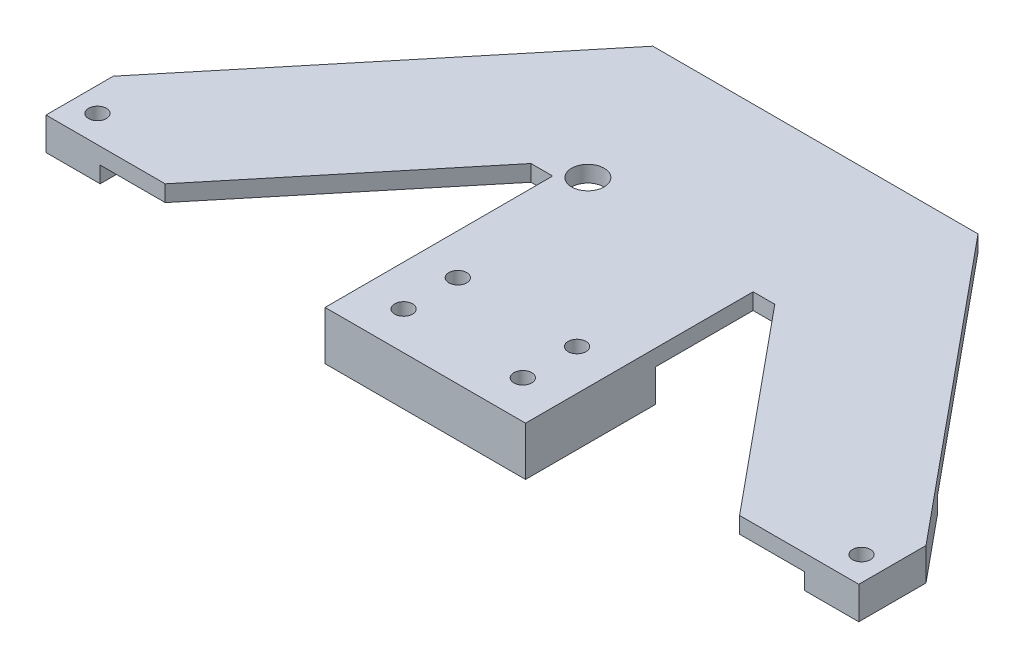
ISO-10303-21;
HEADER;
FILE_DESCRIPTION(('STEP AP214'),'2;1');
FILE_NAME('part.step','',(''),(''),'','','');
FILE_SCHEMA(('AUTOMOTIVE_DESIGN { 1 0 10303 214 1 1 1 1 }'));
ENDSEC;
DATA;
#1=APPLICATION_CONTEXT('core data for automotive mechanical design processes');
#2=APPLICATION_PROTOCOL_DEFINITION('international standard','automotive_design',2000,#1);
#3=PRODUCT_CONTEXT('',#1,'mechanical');
#4=PRODUCT('Part','Part','',(#3));
#5=PRODUCT_RELATED_PRODUCT_CATEGORY('part','',(#4));
#6=PRODUCT_DEFINITION_FORMATION('','',#4);
#7=PRODUCT_DEFINITION_CONTEXT('part definition',#1,'design');
#8=PRODUCT_DEFINITION('design','',#6,#7);
#9=PRODUCT_DEFINITION_SHAPE('','',#8);
#10=(LENGTH_UNIT() NAMED_UNIT(*) SI_UNIT(.MILLI.,.METRE.));
#11=(NAMED_UNIT(*) PLANE_ANGLE_UNIT() SI_UNIT($,.RADIAN.));
#12=(NAMED_UNIT(*) SI_UNIT($,.STERADIAN.) SOLID_ANGLE_UNIT());
#13=UNCERTAINTY_MEASURE_WITH_UNIT(LENGTH_MEASURE(1.E-05),#10,'distance_accuracy_value','');
#14=(GEOMETRIC_REPRESENTATION_CONTEXT(3) GLOBAL_UNCERTAINTY_ASSIGNED_CONTEXT((#13)) GLOBAL_UNIT_ASSIGNED_CONTEXT((#10,
#11,#12)) REPRESENTATION_CONTEXT('',''));
#15=CARTESIAN_POINT('',(0.,0.,0.));
#16=DIRECTION('',(0.,0.,1.));
#17=DIRECTION('',(1.,0.,0.));
#18=AXIS2_PLACEMENT_3D('',#15,#16,#17);
#19=CARTESIAN_POINT('',(75.,3.,0.));
#20=DIRECTION('',(1.,0.,0.));
#21=DIRECTION('',(0.,0.,-1.));
#22=AXIS2_PLACEMENT_3D('',#19,#20,#21);
#23=PLANE('',#22);
#24=DIRECTION('',(0.,-1.,0.));
#25=VECTOR('',#24,1.);
#26=CARTESIAN_POINT('',(75.,3.,37.));
#27=LINE('',#26,#25);
#28=CARTESIAN_POINT('',(75.,3.,37.));
#29=VERTEX_POINT('',#28);
#30=CARTESIAN_POINT('',(75.,-3.,37.));
#31=VERTEX_POINT('',#30);
#32=EDGE_CURVE('E318',#29,#31,#27,.T.);
#33=ORIENTED_EDGE('',*,*,#32,.T.);
#34=DIRECTION('',(0.,0.,-1.));
#35=VECTOR('',#34,1.);
#36=CARTESIAN_POINT('',(75.,-3.,37.));
#37=LINE('',#36,#35);
#38=CARTESIAN_POINT('',(75.,-3.,24.5901639344262));
#39=VERTEX_POINT('',#38);
#40=EDGE_CURVE('E223',#31,#39,#37,.T.);
#41=ORIENTED_EDGE('',*,*,#40,.T.);
#42=DIRECTION('',(0.,-1.,0.));
#43=VECTOR('',#42,1.);
#44=CARTESIAN_POINT('',(75.,3.,24.5901639344262));
#45=LINE('',#44,#43);
#46=CARTESIAN_POINT('',(75.,3.,24.5901639344262));
#47=VERTEX_POINT('',#46);
#48=EDGE_CURVE('E11',#47,#39,#45,.T.);
#49=ORIENTED_EDGE('',*,*,#48,.F.);
#50=DIRECTION('',(0.,0.,1.));
#51=VECTOR('',#50,1.);
#52=CARTESIAN_POINT('',(75.,3.,0.));
#53=LINE('',#52,#51);
#54=EDGE_CURVE('E280',#47,#29,#53,.T.);
#55=ORIENTED_EDGE('',*,*,#54,.T.);
#56=EDGE_LOOP('',(#33,#41,#49,#55));
#57=FACE_BOUND('',#56,.T.);
#58=ADVANCED_FACE('F35',(#57),#23,.T.);
#59=CARTESIAN_POINT('',(32.5867130586061,3.,-26.8620202239861));
#60=DIRECTION('',(0.771629151369793,0.,-0.636072678831856));
#61=DIRECTION('',(-0.636072678831856,0.,-0.771629151369793));
#62=AXIS2_PLACEMENT_3D('',#59,#60,#61);
#63=PLANE('',#62);
#64=DIRECTION('',(0.636072678831856,0.,0.771629151369793));
#65=VECTOR('',#64,1.);
#66=CARTESIAN_POINT('',(32.5867130586061,0.,-26.8620202239861));
#67=LINE('',#66,#65);
#68=CARTESIAN_POINT('',(30.,0.,-30.));
#69=VERTEX_POINT('',#68);
#70=CARTESIAN_POINT('',(65.,0.,12.4590163934426));
#71=VERTEX_POINT('',#70);
#72=EDGE_CURVE('E271',#69,#71,#67,.T.);
#73=ORIENTED_EDGE('',*,*,#72,.F.);
#74=DIRECTION('',(0.,-1.,0.));
#75=VECTOR('',#74,1.);
#76=CARTESIAN_POINT('',(30.,3.,-30.));
#77=LINE('',#76,#75);
#78=CARTESIAN_POINT('',(30.,3.,-30.));
#79=VERTEX_POINT('',#78);
#80=EDGE_CURVE('E44',#79,#69,#77,.T.);
#81=ORIENTED_EDGE('',*,*,#80,.F.);
#82=DIRECTION('',(0.636072678831856,0.,0.771629151369793));
#83=VECTOR('',#82,1.);
#84=CARTESIAN_POINT('',(32.5867130586061,3.,-26.8620202239861));
#85=LINE('',#84,#83);
#86=EDGE_CURVE('E283',#79,#47,#85,.T.);
#87=ORIENTED_EDGE('',*,*,#86,.T.);
#88=ORIENTED_EDGE('',*,*,#48,.T.);
#89=DIRECTION('',(-0.636072678831856,0.,-0.771629151369793));
#90=VECTOR('',#89,1.);
#91=CARTESIAN_POINT('',(75.,-3.,24.5901639344262));
#92=LINE('',#91,#90);
#93=CARTESIAN_POINT('',(65.,-3.,12.4590163934426));
#94=VERTEX_POINT('',#93);
#95=EDGE_CURVE('E214',#39,#94,#92,.T.);
#96=ORIENTED_EDGE('',*,*,#95,.T.);
#97=DIRECTION('',(0.,1.,0.));
#98=VECTOR('',#97,1.);
#99=CARTESIAN_POINT('',(65.,-3.,12.4590163934426));
#100=LINE('',#99,#98);
#101=EDGE_CURVE('E226',#94,#71,#100,.T.);
#102=ORIENTED_EDGE('',*,*,#101,.T.);
#103=EDGE_LOOP('',(#73,#81,#87,#88,#96,#102));
#104=FACE_BOUND('',#103,.T.);
#105=ADVANCED_FACE('F395',(#104),#63,.T.);
#106=CARTESIAN_POINT('',(0.,3.,-30.));
#107=DIRECTION('',(0.,0.,-1.));
#108=DIRECTION('',(-1.,0.,0.));
#109=AXIS2_PLACEMENT_3D('',#106,#107,#108);
#110=PLANE('',#109);
#111=DIRECTION('',(1.,0.,0.));
#112=VECTOR('',#111,1.);
#113=CARTESIAN_POINT('',(0.,0.,-30.));
#114=LINE('',#113,#112);
#115=CARTESIAN_POINT('',(-30.,0.,-30.));
#116=VERTEX_POINT('',#115);
#117=EDGE_CURVE('E321',#116,#69,#114,.T.);
#118=ORIENTED_EDGE('',*,*,#117,.F.);
#119=DIRECTION('',(0.,-1.,0.));
#120=VECTOR('',#119,1.);
#121=CARTESIAN_POINT('',(-30.,3.,-30.));
#122=LINE('',#121,#120);
#123=CARTESIAN_POINT('',(-30.,3.,-30.));
#124=VERTEX_POINT('',#123);
#125=EDGE_CURVE('E364',#124,#116,#122,.T.);
#126=ORIENTED_EDGE('',*,*,#125,.F.);
#127=DIRECTION('',(1.,0.,0.));
#128=VECTOR('',#127,1.);
#129=CARTESIAN_POINT('',(0.,3.,-30.));
#130=LINE('',#129,#128);
#131=EDGE_CURVE('E286',#124,#79,#130,.T.);
#132=ORIENTED_EDGE('',*,*,#131,.T.);
#133=ORIENTED_EDGE('',*,*,#80,.T.);
#134=EDGE_LOOP('',(#118,#126,#132,#133));
#135=FACE_BOUND('',#134,.T.);
#136=ADVANCED_FACE('F401',(#135),#110,.T.);
#137=CARTESIAN_POINT('',(-32.5867130586061,3.,-26.8620202239861));
#138=DIRECTION('',(-0.771629151369793,0.,-0.636072678831856));
#139=DIRECTION('',(-0.636072678831856,0.,0.771629151369793));
#140=AXIS2_PLACEMENT_3D('',#137,#138,#139);
#141=PLANE('',#140);
#142=DIRECTION('',(0.636072678831856,0.,-0.771629151369793));
#143=VECTOR('',#142,1.);
#144=CARTESIAN_POINT('',(-32.5867130586061,0.,-26.8620202239861));
#145=LINE('',#144,#143);
#146=CARTESIAN_POINT('',(-65.,0.,12.4590163934426));
#147=VERTEX_POINT('',#146);
#148=EDGE_CURVE('E324',#147,#116,#145,.T.);
#149=ORIENTED_EDGE('',*,*,#148,.F.);
#150=DIRECTION('',(0.,1.,0.));
#151=VECTOR('',#150,1.);
#152=CARTESIAN_POINT('',(-65.,-3.,12.4590163934426));
#153=LINE('',#152,#151);
#154=CARTESIAN_POINT('',(-65.,-3.,12.4590163934426));
#155=VERTEX_POINT('',#154);
#156=EDGE_CURVE('E206',#155,#147,#153,.T.);
#157=ORIENTED_EDGE('',*,*,#156,.F.);
#158=DIRECTION('',(-0.636072678831856,0.,0.771629151369793));
#159=VECTOR('',#158,1.);
#160=CARTESIAN_POINT('',(-75.,-3.,24.5901639344262));
#161=LINE('',#160,#159);
#162=CARTESIAN_POINT('',(-75.,-3.,24.5901639344262));
#163=VERTEX_POINT('',#162);
#164=EDGE_CURVE('E203',#155,#163,#161,.T.);
#165=ORIENTED_EDGE('',*,*,#164,.T.);
#166=DIRECTION('',(0.,-1.,0.));
#167=VECTOR('',#166,1.);
#168=CARTESIAN_POINT('',(-75.,3.,24.5901639344262));
#169=LINE('',#168,#167);
#170=CARTESIAN_POINT('',(-75.,3.,24.5901639344262));
#171=VERTEX_POINT('',#170);
#172=EDGE_CURVE('E183',#171,#163,#169,.T.);
#173=ORIENTED_EDGE('',*,*,#172,.F.);
#174=DIRECTION('',(0.636072678831856,0.,-0.771629151369793));
#175=VECTOR('',#174,1.);
#176=CARTESIAN_POINT('',(-32.5867130586061,3.,-26.8620202239861));
#177=LINE('',#176,#175);
#178=EDGE_CURVE('E289',#171,#124,#177,.T.);
#179=ORIENTED_EDGE('',*,*,#178,.T.);
#180=ORIENTED_EDGE('',*,*,#125,.T.);
#181=EDGE_LOOP('',(#149,#157,#165,#173,#179,#180));
#182=FACE_BOUND('',#181,.T.);
#183=ADVANCED_FACE('F448',(#182),#141,.T.);
#184=CARTESIAN_POINT('',(-75.,3.,0.));
#185=DIRECTION('',(1.,0.,0.));
#186=DIRECTION('',(0.,0.,-1.));
#187=AXIS2_PLACEMENT_3D('',#184,#185,#186);
#188=PLANE('',#187);
#189=ORIENTED_EDGE('',*,*,#172,.T.);
#190=DIRECTION('',(0.,0.,1.));
#191=VECTOR('',#190,1.);
#192=CARTESIAN_POINT('',(-75.,-3.,37.));
#193=LINE('',#192,#191);
#194=CARTESIAN_POINT('',(-75.,-3.,37.));
#195=VERTEX_POINT('',#194);
#196=EDGE_CURVE('E191',#163,#195,#193,.T.);
#197=ORIENTED_EDGE('',*,*,#196,.T.);
#198=DIRECTION('',(0.,-1.,0.));
#199=VECTOR('',#198,1.);
#200=CARTESIAN_POINT('',(-75.,3.,37.));
#201=LINE('',#200,#199);
#202=CARTESIAN_POINT('',(-75.,3.,37.));
#203=VERTEX_POINT('',#202);
#204=EDGE_CURVE('E174',#203,#195,#201,.T.);
#205=ORIENTED_EDGE('',*,*,#204,.F.);
#206=DIRECTION('',(0.,0.,1.));
#207=VECTOR('',#206,1.);
#208=CARTESIAN_POINT('',(-75.,3.,0.));
#209=LINE('',#208,#207);
#210=EDGE_CURVE('E292',#171,#203,#209,.T.);
#211=ORIENTED_EDGE('',*,*,#210,.F.);
#212=EDGE_LOOP('',(#189,#197,#205,#211));
#213=FACE_BOUND('',#212,.T.);
#214=ADVANCED_FACE('F196',(#213),#188,.F.);
#215=CARTESIAN_POINT('',(0.,3.,37.0000000000001));
#216=DIRECTION('',(0.,0.,1.));
#217=DIRECTION('',(1.,0.,0.));
#218=AXIS2_PLACEMENT_3D('',#215,#216,#217);
#219=PLANE('',#218);
#220=DIRECTION('',(-1.,0.,0.));
#221=VECTOR('',#220,1.);
#222=CARTESIAN_POINT('',(0.,0.,37.0000000000001));
#223=LINE('',#222,#221);
#224=CARTESIAN_POINT('',(-53.,0.,37.));
#225=VERTEX_POINT('',#224);
#226=CARTESIAN_POINT('',(-65.,0.,37.));
#227=VERTEX_POINT('',#226);
#228=EDGE_CURVE('E57',#225,#227,#223,.T.);
#229=ORIENTED_EDGE('',*,*,#228,.F.);
#230=DIRECTION('',(0.,-1.,0.));
#231=VECTOR('',#230,1.);
#232=CARTESIAN_POINT('',(-53.,3.,37.));
#233=LINE('',#232,#231);
#234=CARTESIAN_POINT('',(-53.,3.,37.));
#235=VERTEX_POINT('',#234);
#236=EDGE_CURVE('E184',#235,#225,#233,.T.);
#237=ORIENTED_EDGE('',*,*,#236,.F.);
#238=DIRECTION('',(-1.,0.,0.));
#239=VECTOR('',#238,1.);
#240=CARTESIAN_POINT('',(0.,3.,37.0000000000001));
#241=LINE('',#240,#239);
#242=EDGE_CURVE('E179',#235,#203,#241,.T.);
#243=ORIENTED_EDGE('',*,*,#242,.T.);
#244=ORIENTED_EDGE('',*,*,#204,.T.);
#245=DIRECTION('',(1.,0.,0.));
#246=VECTOR('',#245,1.);
#247=CARTESIAN_POINT('',(-65.,-3.,37.));
#248=LINE('',#247,#246);
#249=CARTESIAN_POINT('',(-65.,-3.,37.));
#250=VERTEX_POINT('',#249);
#251=EDGE_CURVE('E177',#195,#250,#248,.T.);
#252=ORIENTED_EDGE('',*,*,#251,.T.);
#253=DIRECTION('',(0.,1.,0.));
#254=VECTOR('',#253,1.);
#255=CARTESIAN_POINT('',(-65.,-3.,37.));
#256=LINE('',#255,#254);
#257=EDGE_CURVE('E204',#250,#227,#256,.T.);
#258=ORIENTED_EDGE('',*,*,#257,.T.);
#259=EDGE_LOOP('',(#229,#237,#243,#244,#252,#258));
#260=FACE_BOUND('',#259,.T.);
#261=ADVANCED_FACE('F176',(#260),#219,.T.);
#262=CARTESIAN_POINT('',(-13.3967598129825,3.,-11.0432749809721));
#263=DIRECTION('',(0.771629151369793,0.,0.636072678831856));
#264=DIRECTION('',(0.636072678831856,0.,-0.771629151369793));
#265=AXIS2_PLACEMENT_3D('',#262,#263,#264);
#266=PLANE('',#265);
#267=DIRECTION('',(-0.636072678831856,0.,0.771629151369793));
#268=VECTOR('',#267,1.);
#269=CARTESIAN_POINT('',(-13.3967598129825,0.,-11.0432749809721));
#270=LINE('',#269,#268);
#271=CARTESIAN_POINT('',(-22.5,0.,0.));
#272=VERTEX_POINT('',#271);
#273=EDGE_CURVE('E327',#272,#225,#270,.T.);
#274=ORIENTED_EDGE('',*,*,#273,.F.);
#275=DIRECTION('',(0.,-1.,0.));
#276=VECTOR('',#275,1.);
#277=CARTESIAN_POINT('',(-22.5,3.,0.));
#278=LINE('',#277,#276);
#279=CARTESIAN_POINT('',(-22.5,3.,0.));
#280=VERTEX_POINT('',#279);
#281=EDGE_CURVE('E360',#280,#272,#278,.T.);
#282=ORIENTED_EDGE('',*,*,#281,.F.);
#283=DIRECTION('',(-0.636072678831856,0.,0.771629151369793));
#284=VECTOR('',#283,1.);
#285=CARTESIAN_POINT('',(-13.3967598129825,3.,-11.0432749809721));
#286=LINE('',#285,#284);
#287=EDGE_CURVE('E295',#280,#235,#286,.T.);
#288=ORIENTED_EDGE('',*,*,#287,.T.);
#289=ORIENTED_EDGE('',*,*,#236,.T.);
#290=EDGE_LOOP('',(#274,#282,#288,#289));
#291=FACE_BOUND('',#290,.T.);
#292=ADVANCED_FACE('F452',(#291),#266,.T.);
#293=CARTESIAN_POINT('',(0.,3.,0.));
#294=DIRECTION('',(0.,0.,-1.));
#295=DIRECTION('',(-1.,0.,0.));
#296=AXIS2_PLACEMENT_3D('',#293,#294,#295);
#297=PLANE('',#296);
#298=DIRECTION('',(1.,0.,0.));
#299=VECTOR('',#298,1.);
#300=CARTESIAN_POINT('',(0.,0.,0.));
#301=LINE('',#300,#299);
#302=CARTESIAN_POINT('',(-18.5,0.,0.));
#303=VERTEX_POINT('',#302);
#304=EDGE_CURVE('E329',#272,#303,#301,.T.);
#305=ORIENTED_EDGE('',*,*,#304,.T.);
#306=DIRECTION('',(0.,-1.,0.));
#307=VECTOR('',#306,1.);
#308=CARTESIAN_POINT('',(-18.5,3.,0.));
#309=LINE('',#308,#307);
#310=CARTESIAN_POINT('',(-18.5,3.,0.));
#311=VERTEX_POINT('',#310);
#312=EDGE_CURVE('E357',#311,#303,#309,.T.);
#313=ORIENTED_EDGE('',*,*,#312,.F.);
#314=DIRECTION('',(1.,0.,0.));
#315=VECTOR('',#314,1.);
#316=CARTESIAN_POINT('',(0.,3.,0.));
#317=LINE('',#316,#315);
#318=EDGE_CURVE('E298',#280,#311,#317,.T.);
#319=ORIENTED_EDGE('',*,*,#318,.F.);
#320=ORIENTED_EDGE('',*,*,#281,.T.);
#321=EDGE_LOOP('',(#305,#313,#319,#320));
#322=FACE_BOUND('',#321,.T.);
#323=ADVANCED_FACE('F457',(#322),#297,.F.);
#324=CARTESIAN_POINT('',(-18.5,3.,0.));
#325=DIRECTION('',(1.,0.,0.));
#326=DIRECTION('',(0.,0.,-1.));
#327=AXIS2_PLACEMENT_3D('',#324,#325,#326);
#328=PLANE('',#327);
#329=DIRECTION('',(0.,0.,1.));
#330=VECTOR('',#329,1.);
#331=CARTESIAN_POINT('',(-18.5,0.,0.));
#332=LINE('',#331,#330);
#333=CARTESIAN_POINT('',(-18.5,0.,18.));
#334=VERTEX_POINT('',#333);
#335=EDGE_CURVE('E332',#303,#334,#332,.T.);
#336=ORIENTED_EDGE('',*,*,#335,.T.);
#337=DIRECTION('',(0.,1.,0.));
#338=VECTOR('',#337,1.);
#339=CARTESIAN_POINT('',(-18.5,-6.,18.));
#340=LINE('',#339,#338);
#341=CARTESIAN_POINT('',(-18.5,-6.,18.));
#342=VERTEX_POINT('',#341);
#343=EDGE_CURVE('E266',#342,#334,#340,.T.);
#344=ORIENTED_EDGE('',*,*,#343,.F.);
#345=DIRECTION('',(0.,0.,1.));
#346=VECTOR('',#345,1.);
#347=CARTESIAN_POINT('',(-18.5,-6.,18.));
#348=LINE('',#347,#346);
#349=CARTESIAN_POINT('',(-18.5,-6.,42.));
#350=VERTEX_POINT('',#349);
#351=EDGE_CURVE('E257',#342,#350,#348,.T.);
#352=ORIENTED_EDGE('',*,*,#351,.T.);
#353=DIRECTION('',(0.,-1.,0.));
#354=VECTOR('',#353,1.);
#355=CARTESIAN_POINT('',(-18.5,3.,42.));
#356=LINE('',#355,#354);
#357=CARTESIAN_POINT('',(-18.5,3.,42.));
#358=VERTEX_POINT('',#357);
#359=EDGE_CURVE('E355',#358,#350,#356,.T.);
#360=ORIENTED_EDGE('',*,*,#359,.F.);
#361=DIRECTION('',(0.,0.,1.));
#362=VECTOR('',#361,1.);
#363=CARTESIAN_POINT('',(-18.5,3.,0.));
#364=LINE('',#363,#362);
#365=EDGE_CURVE('E301',#311,#358,#364,.T.);
#366=ORIENTED_EDGE('',*,*,#365,.F.);
#367=ORIENTED_EDGE('',*,*,#312,.T.);
#368=EDGE_LOOP('',(#336,#344,#352,#360,#366,#367));
#369=FACE_BOUND('',#368,.T.);
#370=ADVANCED_FACE('F461',(#369),#328,.F.);
#371=CARTESIAN_POINT('',(0.,3.,42.));
#372=DIRECTION('',(0.,0.,-1.));
#373=DIRECTION('',(-1.,0.,0.));
#374=AXIS2_PLACEMENT_3D('',#371,#372,#373);
#375=PLANE('',#374);
#376=ORIENTED_EDGE('',*,*,#359,.T.);
#377=DIRECTION('',(1.,0.,0.));
#378=VECTOR('',#377,1.);
#379=CARTESIAN_POINT('',(-18.5,-6.,42.));
#380=LINE('',#379,#378);
#381=CARTESIAN_POINT('',(18.5,-6.,42.));
#382=VERTEX_POINT('',#381);
#383=EDGE_CURVE('E260',#350,#382,#380,.T.);
#384=ORIENTED_EDGE('',*,*,#383,.T.);
#385=DIRECTION('',(0.,-1.,0.));
#386=VECTOR('',#385,1.);
#387=CARTESIAN_POINT('',(18.5,3.,42.));
#388=LINE('',#387,#386);
#389=CARTESIAN_POINT('',(18.5,3.,42.));
#390=VERTEX_POINT('',#389);
#391=EDGE_CURVE('E353',#390,#382,#388,.T.);
#392=ORIENTED_EDGE('',*,*,#391,.F.);
#393=DIRECTION('',(1.,0.,0.));
#394=VECTOR('',#393,1.);
#395=CARTESIAN_POINT('',(0.,3.,42.));
#396=LINE('',#395,#394);
#397=EDGE_CURVE('E304',#358,#390,#396,.T.);
#398=ORIENTED_EDGE('',*,*,#397,.F.);
#399=EDGE_LOOP('',(#376,#384,#392,#398));
#400=FACE_BOUND('',#399,.T.);
#401=ADVANCED_FACE('F465',(#400),#375,.F.);
#402=CARTESIAN_POINT('',(18.5,3.,0.));
#403=DIRECTION('',(-1.,0.,0.));
#404=DIRECTION('',(0.,0.,1.));
#405=AXIS2_PLACEMENT_3D('',#402,#403,#404);
#406=PLANE('',#405);
#407=ORIENTED_EDGE('',*,*,#391,.T.);
#408=DIRECTION('',(0.,0.,-1.));
#409=VECTOR('',#408,1.);
#410=CARTESIAN_POINT('',(18.5,-6.,42.));
#411=LINE('',#410,#409);
#412=CARTESIAN_POINT('',(18.5,-6.,18.));
#413=VERTEX_POINT('',#412);
#414=EDGE_CURVE('E263',#382,#413,#411,.T.);
#415=ORIENTED_EDGE('',*,*,#414,.T.);
#416=DIRECTION('',(0.,1.,0.));
#417=VECTOR('',#416,1.);
#418=CARTESIAN_POINT('',(18.5,-6.,18.));
#419=LINE('',#418,#417);
#420=CARTESIAN_POINT('',(18.5,0.,18.));
#421=VERTEX_POINT('',#420);
#422=EDGE_CURVE('E269',#413,#421,#419,.T.);
#423=ORIENTED_EDGE('',*,*,#422,.T.);
#424=DIRECTION('',(0.,0.,-1.));
#425=VECTOR('',#424,1.);
#426=CARTESIAN_POINT('',(18.5,0.,0.));
#427=LINE('',#426,#425);
#428=CARTESIAN_POINT('',(18.5,0.,0.));
#429=VERTEX_POINT('',#428);
#430=EDGE_CURVE('E335',#421,#429,#427,.T.);
#431=ORIENTED_EDGE('',*,*,#430,.T.);
#432=DIRECTION('',(0.,-1.,0.));
#433=VECTOR('',#432,1.);
#434=CARTESIAN_POINT('',(18.5,3.,0.));
#435=LINE('',#434,#433);
#436=CARTESIAN_POINT('',(18.5,3.,0.));
#437=VERTEX_POINT('',#436);
#438=EDGE_CURVE('E350',#437,#429,#435,.T.);
#439=ORIENTED_EDGE('',*,*,#438,.F.);
#440=DIRECTION('',(0.,0.,-1.));
#441=VECTOR('',#440,1.);
#442=CARTESIAN_POINT('',(18.5,3.,0.));
#443=LINE('',#442,#441);
#444=EDGE_CURVE('E307',#390,#437,#443,.T.);
#445=ORIENTED_EDGE('',*,*,#444,.F.);
#446=EDGE_LOOP('',(#407,#415,#423,#431,#439,#445));
#447=FACE_BOUND('',#446,.T.);
#448=ADVANCED_FACE('F470',(#447),#406,.F.);
#449=CARTESIAN_POINT('',(0.,3.,0.));
#450=DIRECTION('',(0.,0.,-1.));
#451=DIRECTION('',(-1.,0.,0.));
#452=AXIS2_PLACEMENT_3D('',#449,#450,#451);
#453=PLANE('',#452);
#454=DIRECTION('',(1.,0.,0.));
#455=VECTOR('',#454,1.);
#456=CARTESIAN_POINT('',(0.,0.,0.));
#457=LINE('',#456,#455);
#458=CARTESIAN_POINT('',(22.5,0.,0.));
#459=VERTEX_POINT('',#458);
#460=EDGE_CURVE('E337',#429,#459,#457,.T.);
#461=ORIENTED_EDGE('',*,*,#460,.T.);
#462=DIRECTION('',(0.,-1.,0.));
#463=VECTOR('',#462,1.);
#464=CARTESIAN_POINT('',(22.5,3.,0.));
#465=LINE('',#464,#463);
#466=CARTESIAN_POINT('',(22.5,3.,0.));
#467=VERTEX_POINT('',#466);
#468=EDGE_CURVE('E348',#467,#459,#465,.T.);
#469=ORIENTED_EDGE('',*,*,#468,.F.);
#470=DIRECTION('',(1.,0.,0.));
#471=VECTOR('',#470,1.);
#472=CARTESIAN_POINT('',(0.,3.,0.));
#473=LINE('',#472,#471);
#474=EDGE_CURVE('E310',#437,#467,#473,.T.);
#475=ORIENTED_EDGE('',*,*,#474,.F.);
#476=ORIENTED_EDGE('',*,*,#438,.T.);
#477=EDGE_LOOP('',(#461,#469,#475,#476));
#478=FACE_BOUND('',#477,.T.);
#479=ADVANCED_FACE('F415',(#478),#453,.F.);
#480=CARTESIAN_POINT('',(13.3967598129825,3.,-11.0432749809721));
#481=DIRECTION('',(-0.771629151369793,0.,0.636072678831856));
#482=DIRECTION('',(0.636072678831856,0.,0.771629151369793));
#483=AXIS2_PLACEMENT_3D('',#480,#481,#482);
#484=PLANE('',#483);
#485=DIRECTION('',(-0.636072678831856,0.,-0.771629151369793));
#486=VECTOR('',#485,1.);
#487=CARTESIAN_POINT('',(13.3967598129825,0.,-11.0432749809721));
#488=LINE('',#487,#486);
#489=CARTESIAN_POINT('',(53.,0.,37.));
#490=VERTEX_POINT('',#489);
#491=EDGE_CURVE('E340',#490,#459,#488,.T.);
#492=ORIENTED_EDGE('',*,*,#491,.F.);
#493=DIRECTION('',(0.,-1.,0.));
#494=VECTOR('',#493,1.);
#495=CARTESIAN_POINT('',(53.,3.,37.));
#496=LINE('',#495,#494);
#497=CARTESIAN_POINT('',(53.,3.,37.));
#498=VERTEX_POINT('',#497);
#499=EDGE_CURVE('E345',#498,#490,#496,.T.);
#500=ORIENTED_EDGE('',*,*,#499,.F.);
#501=DIRECTION('',(-0.636072678831856,0.,-0.771629151369793));
#502=VECTOR('',#501,1.);
#503=CARTESIAN_POINT('',(13.3967598129825,3.,-11.0432749809721));
#504=LINE('',#503,#502);
#505=EDGE_CURVE('E312',#498,#467,#504,.T.);
#506=ORIENTED_EDGE('',*,*,#505,.T.);
#507=ORIENTED_EDGE('',*,*,#468,.T.);
#508=EDGE_LOOP('',(#492,#500,#506,#507));
#509=FACE_BOUND('',#508,.T.);
#510=ADVANCED_FACE('F407',(#509),#484,.T.);
#511=CARTESIAN_POINT('',(70.5,3.,32.));
#512=DIRECTION('',(0.,-1.,0.));
#513=DIRECTION('',(0.,0.,-1.));
#514=AXIS2_PLACEMENT_3D('',#511,#512,#513);
#515=CYLINDRICAL_SURFACE('',#514,1.65);
#516=CARTESIAN_POINT('',(70.5,3.,32.));
#517=DIRECTION('',(0.,1.,0.));
#518=DIRECTION('',(0.,0.,1.));
#519=AXIS2_PLACEMENT_3D('',#516,#517,#518);
#520=CIRCLE('',#519,1.65);
#521=CARTESIAN_POINT('',(70.5,3.,33.65));
#522=VERTEX_POINT('',#521);
#523=EDGE_CURVE('E276',#522,#522,#520,.T.);
#524=ORIENTED_EDGE('',*,*,#523,.T.);
#525=EDGE_LOOP('',(#524));
#526=FACE_BOUND('',#525,.T.);
#527=CARTESIAN_POINT('',(70.5,-3.,32.));
#528=DIRECTION('',(0.,1.,0.));
#529=DIRECTION('',(0.,0.,1.));
#530=AXIS2_PLACEMENT_3D('',#527,#528,#529);
#531=CIRCLE('',#530,1.65);
#532=CARTESIAN_POINT('',(70.5,-3.,33.65));
#533=VERTEX_POINT('',#532);
#534=EDGE_CURVE('E209',#533,#533,#531,.T.);
#535=ORIENTED_EDGE('',*,*,#534,.F.);
#536=EDGE_LOOP('',(#535));
#537=FACE_BOUND('',#536,.T.);
#538=ADVANCED_FACE('F405',(#526,#537),#515,.F.);
#539=CARTESIAN_POINT('',(-70.5,3.,32.));
#540=DIRECTION('',(0.,-1.,0.));
#541=DIRECTION('',(0.,0.,-1.));
#542=AXIS2_PLACEMENT_3D('',#539,#540,#541);
#543=CYLINDRICAL_SURFACE('',#542,1.65);
#544=CARTESIAN_POINT('',(-70.5,3.,32.));
#545=DIRECTION('',(0.,1.,0.));
#546=DIRECTION('',(0.,0.,1.));
#547=AXIS2_PLACEMENT_3D('',#544,#545,#546);
#548=CIRCLE('',#547,1.65);
#549=CARTESIAN_POINT('',(-70.5,3.,33.65));
#550=VERTEX_POINT('',#549);
#551=EDGE_CURVE('E273',#550,#550,#548,.T.);
#552=ORIENTED_EDGE('',*,*,#551,.T.);
#553=EDGE_LOOP('',(#552));
#554=FACE_BOUND('',#553,.T.);
#555=CARTESIAN_POINT('',(-70.5,-3.,32.));
#556=DIRECTION('',(0.,1.,0.));
#557=DIRECTION('',(0.,0.,1.));
#558=AXIS2_PLACEMENT_3D('',#555,#556,#557);
#559=CIRCLE('',#558,1.65);
#560=CARTESIAN_POINT('',(-70.5,-3.,33.65));
#561=VERTEX_POINT('',#560);
#562=EDGE_CURVE('E198',#561,#561,#559,.T.);
#563=ORIENTED_EDGE('',*,*,#562,.F.);
#564=EDGE_LOOP('',(#563));
#565=FACE_BOUND('',#564,.T.);
#566=ADVANCED_FACE('F37',(#554,#565),#543,.F.);
#567=CARTESIAN_POINT('',(0.,3.,37.0000000000001));
#568=DIRECTION('',(0.,0.,1.));
#569=DIRECTION('',(1.,0.,0.));
#570=AXIS2_PLACEMENT_3D('',#567,#568,#569);
#571=PLANE('',#570);
#572=DIRECTION('',(-1.,0.,0.));
#573=VECTOR('',#572,1.);
#574=CARTESIAN_POINT('',(0.,0.,37.0000000000001));
#575=LINE('',#574,#573);
#576=CARTESIAN_POINT('',(65.,0.,37.));
#577=VERTEX_POINT('',#576);
#578=EDGE_CURVE('E277',#577,#490,#575,.T.);
#579=ORIENTED_EDGE('',*,*,#578,.F.);
#580=DIRECTION('',(0.,1.,0.));
#581=VECTOR('',#580,1.);
#582=CARTESIAN_POINT('',(65.,-3.,37.));
#583=LINE('',#582,#581);
#584=CARTESIAN_POINT('',(65.,-3.,37.));
#585=VERTEX_POINT('',#584);
#586=EDGE_CURVE('E229',#585,#577,#583,.T.);
#587=ORIENTED_EDGE('',*,*,#586,.F.);
#588=DIRECTION('',(1.,0.,0.));
#589=VECTOR('',#588,1.);
#590=CARTESIAN_POINT('',(65.,-3.,37.));
#591=LINE('',#590,#589);
#592=EDGE_CURVE('E220',#585,#31,#591,.T.);
#593=ORIENTED_EDGE('',*,*,#592,.T.);
#594=ORIENTED_EDGE('',*,*,#32,.F.);
#595=DIRECTION('',(-1.,0.,0.));
#596=VECTOR('',#595,1.);
#597=CARTESIAN_POINT('',(0.,3.,37.0000000000001));
#598=LINE('',#597,#596);
#599=EDGE_CURVE('E315',#29,#498,#598,.T.);
#600=ORIENTED_EDGE('',*,*,#599,.T.);
#601=ORIENTED_EDGE('',*,*,#499,.T.);
#602=EDGE_LOOP('',(#579,#587,#593,#594,#600,#601));
#603=FACE_BOUND('',#602,.T.);
#604=ADVANCED_FACE('F413',(#603),#571,.T.);
#605=CARTESIAN_POINT('',(0.,3.,0.));
#606=DIRECTION('',(0.,1.,0.));
#607=DIRECTION('',(0.,0.,1.));
#608=AXIS2_PLACEMENT_3D('',#605,#606,#607);
#609=PLANE('',#608);
#610=CARTESIAN_POINT('',(-15.,3.,-3.));
#611=DIRECTION('',(0.,1.,0.));
#612=DIRECTION('',(0.,0.,1.));
#613=AXIS2_PLACEMENT_3D('',#610,#611,#612);
#614=CIRCLE('',#613,2.99999999999995);
#615=CARTESIAN_POINT('',(-15.,3.,0.));
#616=VERTEX_POINT('',#615);
#617=EDGE_CURVE('E235',#616,#616,#614,.F.);
#618=ORIENTED_EDGE('',*,*,#617,.T.);
#619=EDGE_LOOP('',(#618));
#620=FACE_BOUND('',#619,.T.);
#621=CARTESIAN_POINT('',(11.,3.,35.));
#622=DIRECTION('',(0.,1.,0.));
#623=DIRECTION('',(0.,0.,1.));
#624=AXIS2_PLACEMENT_3D('',#621,#622,#623);
#625=CIRCLE('',#624,1.65);
#626=CARTESIAN_POINT('',(11.,3.,36.65));
#627=VERTEX_POINT('',#626);
#628=EDGE_CURVE('E250',#627,#627,#625,.T.);
#629=ORIENTED_EDGE('',*,*,#628,.F.);
#630=EDGE_LOOP('',(#629));
#631=FACE_BOUND('',#630,.T.);
#632=CARTESIAN_POINT('',(-11.,3.,25.));
#633=DIRECTION('',(0.,1.,0.));
#634=DIRECTION('',(0.,0.,1.));
#635=AXIS2_PLACEMENT_3D('',#632,#633,#634);
#636=CIRCLE('',#635,1.65);
#637=CARTESIAN_POINT('',(-11.,3.,26.65));
#638=VERTEX_POINT('',#637);
#639=EDGE_CURVE('E247',#638,#638,#636,.T.);
#640=ORIENTED_EDGE('',*,*,#639,.F.);
#641=EDGE_LOOP('',(#640));
#642=FACE_BOUND('',#641,.T.);
#643=CARTESIAN_POINT('',(11.,3.,25.));
#644=DIRECTION('',(0.,1.,0.));
#645=DIRECTION('',(0.,0.,1.));
#646=AXIS2_PLACEMENT_3D('',#643,#644,#645);
#647=CIRCLE('',#646,1.65);
#648=CARTESIAN_POINT('',(11.,3.,26.65));
#649=VERTEX_POINT('',#648);
#650=EDGE_CURVE('E243',#649,#649,#647,.T.);
#651=ORIENTED_EDGE('',*,*,#650,.F.);
#652=EDGE_LOOP('',(#651));
#653=FACE_BOUND('',#652,.T.);
#654=CARTESIAN_POINT('',(-11.,3.,35.));
#655=DIRECTION('',(0.,1.,0.));
#656=DIRECTION('',(0.,0.,1.));
#657=AXIS2_PLACEMENT_3D('',#654,#655,#656);
#658=CIRCLE('',#657,1.65);
#659=CARTESIAN_POINT('',(-11.,3.,36.65));
#660=VERTEX_POINT('',#659);
#661=EDGE_CURVE('E239',#660,#660,#658,.T.);
#662=ORIENTED_EDGE('',*,*,#661,.F.);
#663=EDGE_LOOP('',(#662));
#664=FACE_BOUND('',#663,.T.);
#665=ORIENTED_EDGE('',*,*,#551,.F.);
#666=EDGE_LOOP('',(#665));
#667=FACE_BOUND('',#666,.T.);
#668=ORIENTED_EDGE('',*,*,#523,.F.);
#669=EDGE_LOOP('',(#668));
#670=FACE_BOUND('',#669,.T.);
#671=ORIENTED_EDGE('',*,*,#54,.F.);
#672=ORIENTED_EDGE('',*,*,#86,.F.);
#673=ORIENTED_EDGE('',*,*,#131,.F.);
#674=ORIENTED_EDGE('',*,*,#178,.F.);
#675=ORIENTED_EDGE('',*,*,#210,.T.);
#676=ORIENTED_EDGE('',*,*,#242,.F.);
#677=ORIENTED_EDGE('',*,*,#287,.F.);
#678=ORIENTED_EDGE('',*,*,#318,.T.);
#679=ORIENTED_EDGE('',*,*,#365,.T.);
#680=ORIENTED_EDGE('',*,*,#397,.T.);
#681=ORIENTED_EDGE('',*,*,#444,.T.);
#682=ORIENTED_EDGE('',*,*,#474,.T.);
#683=ORIENTED_EDGE('',*,*,#505,.F.);
#684=ORIENTED_EDGE('',*,*,#599,.F.);
#685=EDGE_LOOP('',(#671,#672,#673,#674,#675,#676,#677,#678,#679,#680,#681,#682,#683,#684));
#686=FACE_BOUND('',#685,.T.);
#687=ADVANCED_FACE('F446',(#620,#631,#642,#653,#664,#667,#670,#686),#609,.T.);
#688=CARTESIAN_POINT('',(0.,0.,0.));
#689=DIRECTION('',(0.,1.,0.));
#690=DIRECTION('',(0.,0.,1.));
#691=AXIS2_PLACEMENT_3D('',#688,#689,#690);
#692=PLANE('',#691);
#693=CARTESIAN_POINT('',(-15.,0.,-3.));
#694=DIRECTION('',(0.,1.,0.));
#695=DIRECTION('',(0.,0.,1.));
#696=AXIS2_PLACEMENT_3D('',#693,#694,#695);
#697=CIRCLE('',#696,2.99999999999995);
#698=CARTESIAN_POINT('',(-15.,0.,0.));
#699=VERTEX_POINT('',#698);
#700=EDGE_CURVE('E231',#699,#699,#697,.T.);
#701=ORIENTED_EDGE('',*,*,#700,.T.);
#702=EDGE_LOOP('',(#701));
#703=FACE_BOUND('',#702,.T.);
#704=ORIENTED_EDGE('',*,*,#228,.T.);
#705=DIRECTION('',(0.,0.,-1.));
#706=VECTOR('',#705,1.);
#707=CARTESIAN_POINT('',(-65.,0.,12.4590163934426));
#708=LINE('',#707,#706);
#709=EDGE_CURVE('E52',#227,#147,#708,.T.);
#710=ORIENTED_EDGE('',*,*,#709,.T.);
#711=ORIENTED_EDGE('',*,*,#148,.T.);
#712=ORIENTED_EDGE('',*,*,#117,.T.);
#713=ORIENTED_EDGE('',*,*,#72,.T.);
#714=DIRECTION('',(0.,0.,1.));
#715=VECTOR('',#714,1.);
#716=CARTESIAN_POINT('',(65.,0.,12.4590163934426));
#717=LINE('',#716,#715);
#718=EDGE_CURVE('E213',#71,#577,#717,.T.);
#719=ORIENTED_EDGE('',*,*,#718,.T.);
#720=ORIENTED_EDGE('',*,*,#578,.T.);
#721=ORIENTED_EDGE('',*,*,#491,.T.);
#722=ORIENTED_EDGE('',*,*,#460,.F.);
#723=ORIENTED_EDGE('',*,*,#430,.F.);
#724=DIRECTION('',(-1.,0.,0.));
#725=VECTOR('',#724,1.);
#726=CARTESIAN_POINT('',(18.5,0.,18.));
#727=LINE('',#726,#725);
#728=EDGE_CURVE('E253',#421,#334,#727,.T.);
#729=ORIENTED_EDGE('',*,*,#728,.T.);
#730=ORIENTED_EDGE('',*,*,#335,.F.);
#731=ORIENTED_EDGE('',*,*,#304,.F.);
#732=ORIENTED_EDGE('',*,*,#273,.T.);
#733=EDGE_LOOP('',(#704,#710,#711,#712,#713,#719,#720,#721,#722,#723,#729,#730,#731,#732));
#734=FACE_BOUND('',#733,.T.);
#735=ADVANCED_FACE('F441',(#703,#734),#692,.F.);
#736=CARTESIAN_POINT('',(18.5,-6.,18.));
#737=DIRECTION('',(0.,0.,-1.));
#738=DIRECTION('',(-1.,0.,0.));
#739=AXIS2_PLACEMENT_3D('',#736,#737,#738);
#740=PLANE('',#739);
#741=ORIENTED_EDGE('',*,*,#728,.F.);
#742=ORIENTED_EDGE('',*,*,#422,.F.);
#743=DIRECTION('',(-1.,0.,0.));
#744=VECTOR('',#743,1.);
#745=CARTESIAN_POINT('',(18.5,-6.,18.));
#746=LINE('',#745,#744);
#747=EDGE_CURVE('E254',#413,#342,#746,.T.);
#748=ORIENTED_EDGE('',*,*,#747,.T.);
#749=ORIENTED_EDGE('',*,*,#343,.T.);
#750=EDGE_LOOP('',(#741,#742,#748,#749));
#751=FACE_BOUND('',#750,.T.);
#752=ADVANCED_FACE('F480',(#751),#740,.T.);
#753=CARTESIAN_POINT('',(0.,-6.,0.));
#754=DIRECTION('',(0.,1.,0.));
#755=DIRECTION('',(0.,0.,1.));
#756=AXIS2_PLACEMENT_3D('',#753,#754,#755);
#757=PLANE('',#756);
#758=CARTESIAN_POINT('',(11.,-6.,35.));
#759=DIRECTION('',(0.,1.,0.));
#760=DIRECTION('',(0.,0.,1.));
#761=AXIS2_PLACEMENT_3D('',#758,#759,#760);
#762=CIRCLE('',#761,1.65);
#763=CARTESIAN_POINT('',(11.,-6.,36.65));
#764=VERTEX_POINT('',#763);
#765=EDGE_CURVE('E39',#764,#764,#762,.T.);
#766=ORIENTED_EDGE('',*,*,#765,.T.);
#767=EDGE_LOOP('',(#766));
#768=FACE_BOUND('',#767,.T.);
#769=CARTESIAN_POINT('',(-11.,-6.,25.));
#770=DIRECTION('',(0.,1.,0.));
#771=DIRECTION('',(0.,0.,1.));
#772=AXIS2_PLACEMENT_3D('',#769,#770,#771);
#773=CIRCLE('',#772,1.65);
#774=CARTESIAN_POINT('',(-11.,-6.,26.65));
#775=VERTEX_POINT('',#774);
#776=EDGE_CURVE('E246',#775,#775,#773,.T.);
#777=ORIENTED_EDGE('',*,*,#776,.T.);
#778=EDGE_LOOP('',(#777));
#779=FACE_BOUND('',#778,.T.);
#780=CARTESIAN_POINT('',(11.,-6.,25.));
#781=DIRECTION('',(0.,1.,0.));
#782=DIRECTION('',(0.,0.,1.));
#783=AXIS2_PLACEMENT_3D('',#780,#781,#782);
#784=CIRCLE('',#783,1.65);
#785=CARTESIAN_POINT('',(11.,-6.,26.65));
#786=VERTEX_POINT('',#785);
#787=EDGE_CURVE('E242',#786,#786,#784,.T.);
#788=ORIENTED_EDGE('',*,*,#787,.T.);
#789=EDGE_LOOP('',(#788));
#790=FACE_BOUND('',#789,.T.);
#791=CARTESIAN_POINT('',(-11.,-6.,35.));
#792=DIRECTION('',(0.,1.,0.));
#793=DIRECTION('',(0.,0.,1.));
#794=AXIS2_PLACEMENT_3D('',#791,#792,#793);
#795=CIRCLE('',#794,1.65);
#796=CARTESIAN_POINT('',(-11.,-6.,36.65));
#797=VERTEX_POINT('',#796);
#798=EDGE_CURVE('E238',#797,#797,#795,.T.);
#799=ORIENTED_EDGE('',*,*,#798,.T.);
#800=EDGE_LOOP('',(#799));
#801=FACE_BOUND('',#800,.T.);
#802=ORIENTED_EDGE('',*,*,#747,.F.);
#803=ORIENTED_EDGE('',*,*,#414,.F.);
#804=ORIENTED_EDGE('',*,*,#383,.F.);
#805=ORIENTED_EDGE('',*,*,#351,.F.);
#806=EDGE_LOOP('',(#802,#803,#804,#805));
#807=FACE_BOUND('',#806,.T.);
#808=ADVANCED_FACE('F374',(#768,#779,#790,#801,#807),#757,.F.);
#809=CARTESIAN_POINT('',(-11.,-21.,35.));
#810=DIRECTION('',(0.,1.,0.));
#811=DIRECTION('',(0.,0.,1.));
#812=AXIS2_PLACEMENT_3D('',#809,#810,#811);
#813=CYLINDRICAL_SURFACE('',#812,1.65);
#814=ORIENTED_EDGE('',*,*,#661,.T.);
#815=EDGE_LOOP('',(#814));
#816=FACE_BOUND('',#815,.T.);
#817=ORIENTED_EDGE('',*,*,#798,.F.);
#818=EDGE_LOOP('',(#817));
#819=FACE_BOUND('',#818,.T.);
#820=ADVANCED_FACE('F390',(#816,#819),#813,.F.);
#821=CARTESIAN_POINT('',(11.,-21.,25.));
#822=DIRECTION('',(0.,1.,0.));
#823=DIRECTION('',(0.,0.,1.));
#824=AXIS2_PLACEMENT_3D('',#821,#822,#823);
#825=CYLINDRICAL_SURFACE('',#824,1.65);
#826=ORIENTED_EDGE('',*,*,#650,.T.);
#827=EDGE_LOOP('',(#826));
#828=FACE_BOUND('',#827,.T.);
#829=ORIENTED_EDGE('',*,*,#787,.F.);
#830=EDGE_LOOP('',(#829));
#831=FACE_BOUND('',#830,.T.);
#832=ADVANCED_FACE('F380',(#828,#831),#825,.F.);
#833=CARTESIAN_POINT('',(-11.,-21.,25.));
#834=DIRECTION('',(0.,1.,0.));
#835=DIRECTION('',(0.,0.,1.));
#836=AXIS2_PLACEMENT_3D('',#833,#834,#835);
#837=CYLINDRICAL_SURFACE('',#836,1.65);
#838=ORIENTED_EDGE('',*,*,#639,.T.);
#839=EDGE_LOOP('',(#838));
#840=FACE_BOUND('',#839,.T.);
#841=ORIENTED_EDGE('',*,*,#776,.F.);
#842=EDGE_LOOP('',(#841));
#843=FACE_BOUND('',#842,.T.);
#844=ADVANCED_FACE('F377',(#840,#843),#837,.F.);
#845=CARTESIAN_POINT('',(11.,-21.,35.));
#846=DIRECTION('',(0.,1.,0.));
#847=DIRECTION('',(0.,0.,1.));
#848=AXIS2_PLACEMENT_3D('',#845,#846,#847);
#849=CYLINDRICAL_SURFACE('',#848,1.65);
#850=ORIENTED_EDGE('',*,*,#628,.T.);
#851=EDGE_LOOP('',(#850));
#852=FACE_BOUND('',#851,.T.);
#853=ORIENTED_EDGE('',*,*,#765,.F.);
#854=EDGE_LOOP('',(#853));
#855=FACE_BOUND('',#854,.T.);
#856=ADVANCED_FACE('F379',(#852,#855),#849,.F.);
#857=CARTESIAN_POINT('',(-15.,10.,-3.));
#858=DIRECTION('',(0.,-1.,0.));
#859=DIRECTION('',(0.,0.,-1.));
#860=AXIS2_PLACEMENT_3D('',#857,#858,#859);
#861=CYLINDRICAL_SURFACE('',#860,2.99999999999995);
#862=ORIENTED_EDGE('',*,*,#617,.F.);
#863=EDGE_LOOP('',(#862));
#864=FACE_BOUND('',#863,.T.);
#865=ORIENTED_EDGE('',*,*,#700,.F.);
#866=EDGE_LOOP('',(#865));
#867=FACE_BOUND('',#866,.T.);
#868=ADVANCED_FACE('F387',(#864,#867),#861,.F.);
#869=CARTESIAN_POINT('',(65.,-3.,12.4590163934426));
#870=DIRECTION('',(-1.,0.,0.));
#871=DIRECTION('',(0.,0.,1.));
#872=AXIS2_PLACEMENT_3D('',#869,#870,#871);
#873=PLANE('',#872);
#874=ORIENTED_EDGE('',*,*,#718,.F.);
#875=ORIENTED_EDGE('',*,*,#101,.F.);
#876=DIRECTION('',(0.,0.,1.));
#877=VECTOR('',#876,1.);
#878=CARTESIAN_POINT('',(65.,-3.,12.4590163934426));
#879=LINE('',#878,#877);
#880=EDGE_CURVE('E217',#94,#585,#879,.T.);
#881=ORIENTED_EDGE('',*,*,#880,.T.);
#882=ORIENTED_EDGE('',*,*,#586,.T.);
#883=EDGE_LOOP('',(#874,#875,#881,#882));
#884=FACE_BOUND('',#883,.T.);
#885=ADVANCED_FACE('F426',(#884),#873,.T.);
#886=CARTESIAN_POINT('',(0.,-3.,0.));
#887=DIRECTION('',(0.,-1.,0.));
#888=DIRECTION('',(0.,0.,-1.));
#889=AXIS2_PLACEMENT_3D('',#886,#887,#888);
#890=PLANE('',#889);
#891=ORIENTED_EDGE('',*,*,#534,.T.);
#892=EDGE_LOOP('',(#891));
#893=FACE_BOUND('',#892,.T.);
#894=ORIENTED_EDGE('',*,*,#95,.F.);
#895=ORIENTED_EDGE('',*,*,#40,.F.);
#896=ORIENTED_EDGE('',*,*,#592,.F.);
#897=ORIENTED_EDGE('',*,*,#880,.F.);
#898=EDGE_LOOP('',(#894,#895,#896,#897));
#899=FACE_BOUND('',#898,.T.);
#900=ADVANCED_FACE('F422',(#893,#899),#890,.T.);
#901=CARTESIAN_POINT('',(-65.,-3.,12.4590163934426));
#902=DIRECTION('',(1.,0.,0.));
#903=DIRECTION('',(0.,0.,-1.));
#904=AXIS2_PLACEMENT_3D('',#901,#902,#903);
#905=PLANE('',#904);
#906=ORIENTED_EDGE('',*,*,#709,.F.);
#907=ORIENTED_EDGE('',*,*,#257,.F.);
#908=DIRECTION('',(0.,0.,-1.));
#909=VECTOR('',#908,1.);
#910=CARTESIAN_POINT('',(-65.,-3.,12.4590163934426));
#911=LINE('',#910,#909);
#912=EDGE_CURVE('E194',#250,#155,#911,.T.);
#913=ORIENTED_EDGE('',*,*,#912,.T.);
#914=ORIENTED_EDGE('',*,*,#156,.T.);
#915=EDGE_LOOP('',(#906,#907,#913,#914));
#916=FACE_BOUND('',#915,.T.);
#917=ADVANCED_FACE('F425',(#916),#905,.T.);
#918=CARTESIAN_POINT('',(0.,-3.,0.));
#919=DIRECTION('',(0.,1.,0.));
#920=DIRECTION('',(0.,0.,1.));
#921=AXIS2_PLACEMENT_3D('',#918,#919,#920);
#922=PLANE('',#921);
#923=ORIENTED_EDGE('',*,*,#562,.T.);
#924=EDGE_LOOP('',(#923));
#925=FACE_BOUND('',#924,.T.);
#926=ORIENTED_EDGE('',*,*,#196,.F.);
#927=ORIENTED_EDGE('',*,*,#164,.F.);
#928=ORIENTED_EDGE('',*,*,#912,.F.);
#929=ORIENTED_EDGE('',*,*,#251,.F.);
#930=EDGE_LOOP('',(#926,#927,#928,#929));
#931=FACE_BOUND('',#930,.T.);
#932=ADVANCED_FACE('F189',(#925,#931),#922,.F.);
#933=CLOSED_SHELL('',(#58,#105,#136,#183,#214,#261,#292,#323,#370,#401,#448,#479,#510,#538,#566,
#604,#687,#735,#752,#808,#820,#832,#844,#856,#868,#885,#900,#917,#932));
#934=MANIFOLD_SOLID_BREP('B2',#933);
#935=ADVANCED_BREP_SHAPE_REPRESENTATION('',(#18,#934),#14);
#936=SHAPE_DEFINITION_REPRESENTATION(#9,#935);
ENDSEC;
END-ISO-10303-21;
